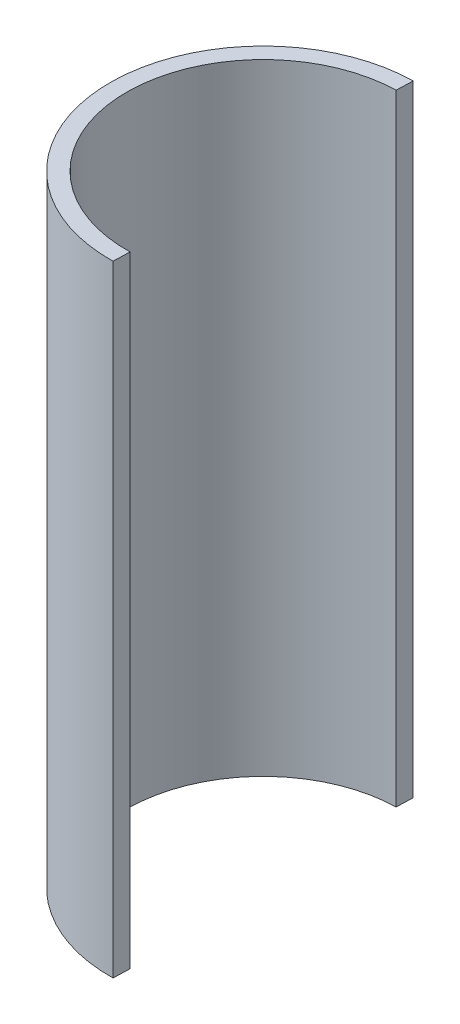
ISO-10303-21;
HEADER;
FILE_DESCRIPTION(('STEP AP214'),'2;1');
FILE_NAME('part.step','',(''),(''),'','','');
FILE_SCHEMA(('AUTOMOTIVE_DESIGN { 1 0 10303 214 1 1 1 1 }'));
ENDSEC;
DATA;
#1=APPLICATION_CONTEXT('core data for automotive mechanical design processes');
#2=APPLICATION_PROTOCOL_DEFINITION('international standard','automotive_design',2000,#1);
#3=PRODUCT_CONTEXT('',#1,'mechanical');
#4=PRODUCT('Part','Part','',(#3));
#5=PRODUCT_RELATED_PRODUCT_CATEGORY('part','',(#4));
#6=PRODUCT_DEFINITION_FORMATION('','',#4);
#7=PRODUCT_DEFINITION_CONTEXT('part definition',#1,'design');
#8=PRODUCT_DEFINITION('design','',#6,#7);
#9=PRODUCT_DEFINITION_SHAPE('','',#8);
#10=(LENGTH_UNIT() NAMED_UNIT(*) SI_UNIT(.MILLI.,.METRE.));
#11=(NAMED_UNIT(*) PLANE_ANGLE_UNIT() SI_UNIT($,.RADIAN.));
#12=(NAMED_UNIT(*) SI_UNIT($,.STERADIAN.) SOLID_ANGLE_UNIT());
#13=UNCERTAINTY_MEASURE_WITH_UNIT(LENGTH_MEASURE(1.E-05),#10,'distance_accuracy_value','');
#14=(GEOMETRIC_REPRESENTATION_CONTEXT(3) GLOBAL_UNCERTAINTY_ASSIGNED_CONTEXT((#13)) GLOBAL_UNIT_ASSIGNED_CONTEXT((#10,
#11,#12)) REPRESENTATION_CONTEXT('',''));
#15=CARTESIAN_POINT('',(0.,0.,0.));
#16=DIRECTION('',(0.,0.,1.));
#17=DIRECTION('',(1.,0.,0.));
#18=AXIS2_PLACEMENT_3D('',#15,#16,#17);
#19=CARTESIAN_POINT('',(0.,150.,0.));
#20=DIRECTION('',(0.,-1.,0.));
#21=DIRECTION('',(0.,0.,-1.));
#22=AXIS2_PLACEMENT_3D('',#19,#20,#21);
#23=CYLINDRICAL_SURFACE('',#22,33.);
#24=CARTESIAN_POINT('',(0.,0.,0.));
#25=DIRECTION('',(0.,-1.,0.));
#26=DIRECTION('',(0.,0.,1.));
#27=AXIS2_PLACEMENT_3D('',#24,#25,#26);
#28=CIRCLE('',#27,33.);
#29=CARTESIAN_POINT('',(0.855268168035512,0.,32.9889150527983));
#30=VERTEX_POINT('',#29);
#31=CARTESIAN_POINT('',(-0.855268168035512,0.,-32.9889150527983));
#32=VERTEX_POINT('',#31);
#33=EDGE_CURVE('E96',#30,#32,#28,.T.);
#34=ORIENTED_EDGE('',*,*,#33,.T.);
#35=DIRECTION('',(0.,-1.,0.));
#36=VECTOR('',#35,1.);
#37=CARTESIAN_POINT('',(-0.855268168035512,150.,-32.9889150527983));
#38=LINE('',#37,#36);
#39=CARTESIAN_POINT('',(-0.855268168035512,150.,-32.9889150527983));
#40=VERTEX_POINT('',#39);
#41=EDGE_CURVE('E11',#40,#32,#38,.T.);
#42=ORIENTED_EDGE('',*,*,#41,.F.);
#43=CARTESIAN_POINT('',(0.,150.,0.));
#44=DIRECTION('',(0.,-1.,0.));
#45=DIRECTION('',(0.,0.,1.));
#46=AXIS2_PLACEMENT_3D('',#43,#44,#45);
#47=CIRCLE('',#46,33.);
#48=CARTESIAN_POINT('',(0.855268168035512,150.,32.9889150527983));
#49=VERTEX_POINT('',#48);
#50=EDGE_CURVE('E84',#49,#40,#47,.T.);
#51=ORIENTED_EDGE('',*,*,#50,.F.);
#52=DIRECTION('',(0.,-1.,0.));
#53=VECTOR('',#52,1.);
#54=CARTESIAN_POINT('',(0.855268168035512,150.,32.9889150527983));
#55=LINE('',#54,#53);
#56=EDGE_CURVE('E92',#49,#30,#55,.T.);
#57=ORIENTED_EDGE('',*,*,#56,.T.);
#58=EDGE_LOOP('',(#34,#42,#51,#57));
#59=FACE_BOUND('',#58,.T.);
#60=ADVANCED_FACE('F33',(#59),#23,.F.);
#61=CARTESIAN_POINT('',(-0.725350772574486,150.,-36.9928894012988));
#62=DIRECTION('',(-0.999474007824583,0.,-0.0324300429087898));
#63=DIRECTION('',(-0.0324300429087898,0.,0.999474007824583));
#64=AXIS2_PLACEMENT_3D('',#61,#62,#63);
#65=PLANE('',#64);
#66=DIRECTION('',(0.0324300429087898,0.,-0.999474007824583));
#67=VECTOR('',#66,1.);
#68=CARTESIAN_POINT('',(-0.725350772574486,0.,-36.9928894012988));
#69=LINE('',#68,#67);
#70=CARTESIAN_POINT('',(-0.725350772574486,0.,-36.9928894012988));
#71=VERTEX_POINT('',#70);
#72=EDGE_CURVE('E88',#32,#71,#69,.T.);
#73=ORIENTED_EDGE('',*,*,#72,.T.);
#74=DIRECTION('',(0.,-1.,0.));
#75=VECTOR('',#74,1.);
#76=CARTESIAN_POINT('',(-0.725350772574486,150.,-36.9928894012988));
#77=LINE('',#76,#75);
#78=CARTESIAN_POINT('',(-0.725350772574486,150.,-36.9928894012988));
#79=VERTEX_POINT('',#78);
#80=EDGE_CURVE('E41',#79,#71,#77,.T.);
#81=ORIENTED_EDGE('',*,*,#80,.F.);
#82=DIRECTION('',(0.0324300429087898,0.,-0.999474007824583));
#83=VECTOR('',#82,1.);
#84=CARTESIAN_POINT('',(-0.725350772574486,150.,-36.9928894012988));
#85=LINE('',#84,#83);
#86=EDGE_CURVE('E79',#40,#79,#85,.T.);
#87=ORIENTED_EDGE('',*,*,#86,.F.);
#88=ORIENTED_EDGE('',*,*,#41,.T.);
#89=EDGE_LOOP('',(#73,#81,#87,#88));
#90=FACE_BOUND('',#89,.T.);
#91=ADVANCED_FACE('F87',(#90),#65,.F.);
#92=CARTESIAN_POINT('',(0.,150.,0.));
#93=DIRECTION('',(0.,-1.,0.));
#94=DIRECTION('',(0.,0.,-1.));
#95=AXIS2_PLACEMENT_3D('',#92,#93,#94);
#96=CYLINDRICAL_SURFACE('',#95,37.);
#97=CARTESIAN_POINT('',(0.,0.,0.));
#98=DIRECTION('',(0.,1.,0.));
#99=DIRECTION('',(0.,0.,1.));
#100=AXIS2_PLACEMENT_3D('',#97,#98,#99);
#101=CIRCLE('',#100,37.);
#102=CARTESIAN_POINT('',(0.7253507725745,0.,36.9928894012988));
#103=VERTEX_POINT('',#102);
#104=EDGE_CURVE('E66',#71,#103,#101,.T.);
#105=ORIENTED_EDGE('',*,*,#104,.T.);
#106=DIRECTION('',(0.,-1.,0.));
#107=VECTOR('',#106,1.);
#108=CARTESIAN_POINT('',(0.7253507725745,150.,36.9928894012988));
#109=LINE('',#108,#107);
#110=CARTESIAN_POINT('',(0.7253507725745,150.,36.9928894012988));
#111=VERTEX_POINT('',#110);
#112=EDGE_CURVE('E89',#111,#103,#109,.T.);
#113=ORIENTED_EDGE('',*,*,#112,.F.);
#114=CARTESIAN_POINT('',(0.,150.,0.));
#115=DIRECTION('',(0.,1.,0.));
#116=DIRECTION('',(0.,0.,1.));
#117=AXIS2_PLACEMENT_3D('',#114,#115,#116);
#118=CIRCLE('',#117,37.);
#119=EDGE_CURVE('E82',#79,#111,#118,.T.);
#120=ORIENTED_EDGE('',*,*,#119,.F.);
#121=ORIENTED_EDGE('',*,*,#80,.T.);
#122=EDGE_LOOP('',(#105,#113,#120,#121));
#123=FACE_BOUND('',#122,.T.);
#124=ADVANCED_FACE('F90',(#123),#96,.T.);
#125=CARTESIAN_POINT('',(0.855268168035512,150.,32.9889150527983));
#126=DIRECTION('',(-0.999474007824583,0.,-0.0324300429087898));
#127=DIRECTION('',(-0.0324300429087898,0.,0.999474007824583));
#128=AXIS2_PLACEMENT_3D('',#125,#126,#127);
#129=PLANE('',#128);
#130=DIRECTION('',(0.0324300429087898,0.,-0.999474007824583));
#131=VECTOR('',#130,1.);
#132=CARTESIAN_POINT('',(0.855268168035512,0.,32.9889150527983));
#133=LINE('',#132,#131);
#134=EDGE_CURVE('E72',#103,#30,#133,.T.);
#135=ORIENTED_EDGE('',*,*,#134,.T.);
#136=ORIENTED_EDGE('',*,*,#56,.F.);
#137=DIRECTION('',(0.0324300429087898,0.,-0.999474007824583));
#138=VECTOR('',#137,1.);
#139=CARTESIAN_POINT('',(0.855268168035512,150.,32.9889150527983));
#140=LINE('',#139,#138);
#141=EDGE_CURVE('E49',#111,#49,#140,.T.);
#142=ORIENTED_EDGE('',*,*,#141,.F.);
#143=ORIENTED_EDGE('',*,*,#112,.T.);
#144=EDGE_LOOP('',(#135,#136,#142,#143));
#145=FACE_BOUND('',#144,.T.);
#146=ADVANCED_FACE('F103',(#145),#129,.F.);
#147=CARTESIAN_POINT('',(0.,150.,0.));
#148=DIRECTION('',(0.,1.,0.));
#149=DIRECTION('',(0.,0.,1.));
#150=AXIS2_PLACEMENT_3D('',#147,#148,#149);
#151=PLANE('',#150);
#152=ORIENTED_EDGE('',*,*,#50,.T.);
#153=ORIENTED_EDGE('',*,*,#86,.T.);
#154=ORIENTED_EDGE('',*,*,#119,.T.);
#155=ORIENTED_EDGE('',*,*,#141,.T.);
#156=EDGE_LOOP('',(#152,#153,#154,#155));
#157=FACE_BOUND('',#156,.T.);
#158=ADVANCED_FACE('F80',(#157),#151,.T.);
#159=CARTESIAN_POINT('',(0.,0.,0.));
#160=DIRECTION('',(0.,1.,0.));
#161=DIRECTION('',(0.,0.,1.));
#162=AXIS2_PLACEMENT_3D('',#159,#160,#161);
#163=PLANE('',#162);
#164=ORIENTED_EDGE('',*,*,#33,.F.);
#165=ORIENTED_EDGE('',*,*,#134,.F.);
#166=ORIENTED_EDGE('',*,*,#104,.F.);
#167=ORIENTED_EDGE('',*,*,#72,.F.);
#168=EDGE_LOOP('',(#164,#165,#166,#167));
#169=FACE_BOUND('',#168,.T.);
#170=ADVANCED_FACE('F106',(#169),#163,.F.);
#171=CLOSED_SHELL('',(#60,#91,#124,#146,#158,#170));
#172=MANIFOLD_SOLID_BREP('B2',#171);
#173=ADVANCED_BREP_SHAPE_REPRESENTATION('',(#18,#172),#14);
#174=SHAPE_DEFINITION_REPRESENTATION(#9,#173);
ENDSEC;
END-ISO-10303-21;
